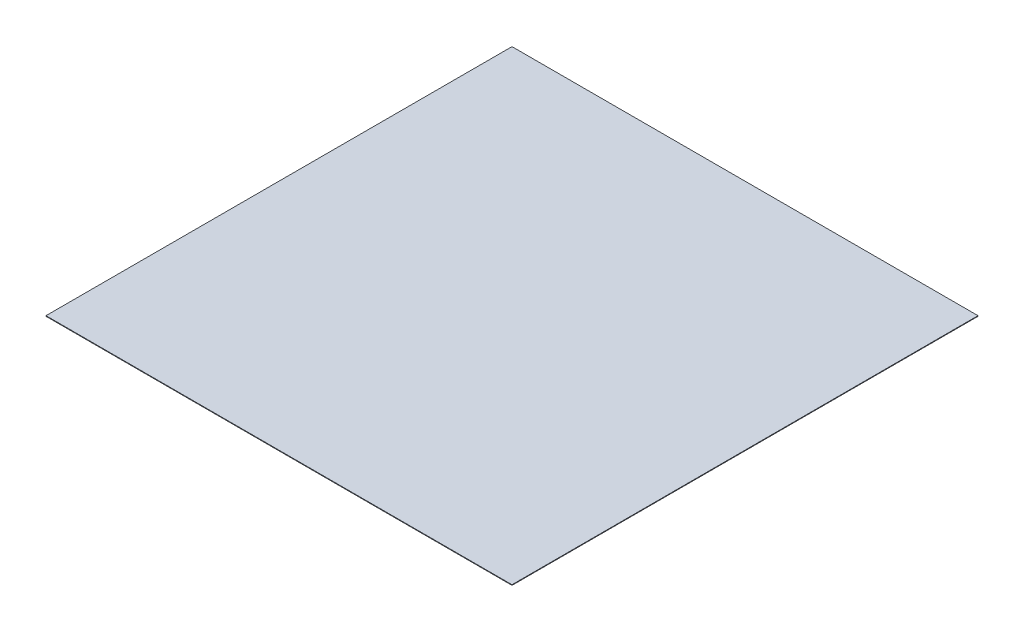
ISO-10303-21;
HEADER;
FILE_DESCRIPTION(('STEP AP214'),'2;1');
FILE_NAME('part.step','',(''),(''),'','','');
FILE_SCHEMA(('AUTOMOTIVE_DESIGN { 1 0 10303 214 1 1 1 1 }'));
ENDSEC;
DATA;
#1=APPLICATION_CONTEXT('core data for automotive mechanical design processes');
#2=APPLICATION_PROTOCOL_DEFINITION('international standard','automotive_design',2000,#1);
#3=PRODUCT_CONTEXT('',#1,'mechanical');
#4=PRODUCT('Part','Part','',(#3));
#5=PRODUCT_RELATED_PRODUCT_CATEGORY('part','',(#4));
#6=PRODUCT_DEFINITION_FORMATION('','',#4);
#7=PRODUCT_DEFINITION_CONTEXT('part definition',#1,'design');
#8=PRODUCT_DEFINITION('design','',#6,#7);
#9=PRODUCT_DEFINITION_SHAPE('','',#8);
#10=(LENGTH_UNIT() NAMED_UNIT(*) SI_UNIT(.MILLI.,.METRE.));
#11=(NAMED_UNIT(*) PLANE_ANGLE_UNIT() SI_UNIT($,.RADIAN.));
#12=(NAMED_UNIT(*) SI_UNIT($,.STERADIAN.) SOLID_ANGLE_UNIT());
#13=UNCERTAINTY_MEASURE_WITH_UNIT(LENGTH_MEASURE(1.E-05),#10,'distance_accuracy_value','');
#14=(GEOMETRIC_REPRESENTATION_CONTEXT(3) GLOBAL_UNCERTAINTY_ASSIGNED_CONTEXT((#13)) GLOBAL_UNIT_ASSIGNED_CONTEXT((#10,
#11,#12)) REPRESENTATION_CONTEXT('',''));
#15=CARTESIAN_POINT('',(0.,0.,0.));
#16=DIRECTION('',(0.,0.,1.));
#17=DIRECTION('',(1.,0.,0.));
#18=AXIS2_PLACEMENT_3D('',#15,#16,#17);
#19=CARTESIAN_POINT('',(7770.36858974359,-78.1666666666667,8000.));
#20=DIRECTION('',(-1.,0.,0.));
#21=DIRECTION('',(0.,0.,1.));
#22=AXIS2_PLACEMENT_3D('',#19,#20,#21);
#23=PLANE('',#22);
#24=DIRECTION('',(0.,1.,0.));
#25=VECTOR('',#24,1.);
#26=CARTESIAN_POINT('',(7770.36858974359,-78.1666666666667,0.));
#27=LINE('',#26,#25);
#28=CARTESIAN_POINT('',(7770.36858974359,-78.1666666666667,0.));
#29=VERTEX_POINT('',#28);
#30=CARTESIAN_POINT('',(7770.36858974359,-68.1666666666657,0.));
#31=VERTEX_POINT('',#30);
#32=EDGE_CURVE('E108',#29,#31,#27,.T.);
#33=ORIENTED_EDGE('',*,*,#32,.T.);
#34=DIRECTION('',(0.,0.,-1.));
#35=VECTOR('',#34,1.);
#36=CARTESIAN_POINT('',(7770.36858974359,-68.1666666666657,8000.));
#37=LINE('',#36,#35);
#38=CARTESIAN_POINT('',(7770.36858974359,-68.1666666666657,8000.));
#39=VERTEX_POINT('',#38);
#40=EDGE_CURVE('E11',#39,#31,#37,.T.);
#41=ORIENTED_EDGE('',*,*,#40,.F.);
#42=DIRECTION('',(0.,1.,0.));
#43=VECTOR('',#42,1.);
#44=CARTESIAN_POINT('',(7770.36858974359,-78.1666666666667,8000.));
#45=LINE('',#44,#43);
#46=CARTESIAN_POINT('',(7770.36858974359,-78.1666666666667,8000.));
#47=VERTEX_POINT('',#46);
#48=EDGE_CURVE('E96',#47,#39,#45,.T.);
#49=ORIENTED_EDGE('',*,*,#48,.F.);
#50=DIRECTION('',(0.,0.,-1.));
#51=VECTOR('',#50,1.);
#52=CARTESIAN_POINT('',(7770.36858974359,-78.1666666666667,8000.));
#53=LINE('',#52,#51);
#54=EDGE_CURVE('E104',#47,#29,#53,.T.);
#55=ORIENTED_EDGE('',*,*,#54,.T.);
#56=EDGE_LOOP('',(#33,#41,#49,#55));
#57=FACE_BOUND('',#56,.T.);
#58=ADVANCED_FACE('F45',(#57),#23,.F.);
#59=CARTESIAN_POINT('',(7770.36858974359,-68.1666666666657,8000.));
#60=DIRECTION('',(0.,-1.,0.));
#61=DIRECTION('',(1.,0.,0.));
#62=AXIS2_PLACEMENT_3D('',#59,#60,#61);
#63=PLANE('',#62);
#64=DIRECTION('',(-1.,0.,0.));
#65=VECTOR('',#64,1.);
#66=CARTESIAN_POINT('',(7770.36858974359,-68.1666666666657,0.));
#67=LINE('',#66,#65);
#68=CARTESIAN_POINT('',(-229.63141025641,-68.1666666666667,0.));
#69=VERTEX_POINT('',#68);
#70=EDGE_CURVE('E100',#31,#69,#67,.T.);
#71=ORIENTED_EDGE('',*,*,#70,.T.);
#72=DIRECTION('',(0.,0.,-1.));
#73=VECTOR('',#72,1.);
#74=CARTESIAN_POINT('',(-229.63141025641,-68.1666666666667,8000.));
#75=LINE('',#74,#73);
#76=CARTESIAN_POINT('',(-229.63141025641,-68.1666666666667,8000.));
#77=VERTEX_POINT('',#76);
#78=EDGE_CURVE('E53',#77,#69,#75,.T.);
#79=ORIENTED_EDGE('',*,*,#78,.F.);
#80=DIRECTION('',(-1.,0.,0.));
#81=VECTOR('',#80,1.);
#82=CARTESIAN_POINT('',(7770.36858974359,-68.1666666666657,8000.));
#83=LINE('',#82,#81);
#84=EDGE_CURVE('E91',#39,#77,#83,.T.);
#85=ORIENTED_EDGE('',*,*,#84,.F.);
#86=ORIENTED_EDGE('',*,*,#40,.T.);
#87=EDGE_LOOP('',(#71,#79,#85,#86));
#88=FACE_BOUND('',#87,.T.);
#89=ADVANCED_FACE('F99',(#88),#63,.F.);
#90=CARTESIAN_POINT('',(-229.63141025641,-68.1666666666667,8000.));
#91=DIRECTION('',(1.,0.,0.));
#92=DIRECTION('',(0.,0.,-1.));
#93=AXIS2_PLACEMENT_3D('',#90,#91,#92);
#94=PLANE('',#93);
#95=DIRECTION('',(0.,-1.,0.));
#96=VECTOR('',#95,1.);
#97=CARTESIAN_POINT('',(-229.63141025641,-68.1666666666667,0.));
#98=LINE('',#97,#96);
#99=CARTESIAN_POINT('',(-229.63141025641,-78.1666666666667,0.));
#100=VERTEX_POINT('',#99);
#101=EDGE_CURVE('E78',#69,#100,#98,.T.);
#102=ORIENTED_EDGE('',*,*,#101,.T.);
#103=DIRECTION('',(0.,0.,-1.));
#104=VECTOR('',#103,1.);
#105=CARTESIAN_POINT('',(-229.63141025641,-78.1666666666667,8000.));
#106=LINE('',#105,#104);
#107=CARTESIAN_POINT('',(-229.63141025641,-78.1666666666667,8000.));
#108=VERTEX_POINT('',#107);
#109=EDGE_CURVE('E101',#108,#100,#106,.T.);
#110=ORIENTED_EDGE('',*,*,#109,.F.);
#111=DIRECTION('',(0.,-1.,0.));
#112=VECTOR('',#111,1.);
#113=CARTESIAN_POINT('',(-229.63141025641,-68.1666666666667,8000.));
#114=LINE('',#113,#112);
#115=EDGE_CURVE('E94',#77,#108,#114,.T.);
#116=ORIENTED_EDGE('',*,*,#115,.F.);
#117=ORIENTED_EDGE('',*,*,#78,.T.);
#118=EDGE_LOOP('',(#102,#110,#116,#117));
#119=FACE_BOUND('',#118,.T.);
#120=ADVANCED_FACE('F102',(#119),#94,.F.);
#121=CARTESIAN_POINT('',(-229.63141025641,-78.1666666666667,8000.));
#122=DIRECTION('',(0.,1.,0.));
#123=DIRECTION('',(-1.,0.,0.));
#124=AXIS2_PLACEMENT_3D('',#121,#122,#123);
#125=PLANE('',#124);
#126=DIRECTION('',(1.,0.,0.));
#127=VECTOR('',#126,1.);
#128=CARTESIAN_POINT('',(-229.63141025641,-78.1666666666667,0.));
#129=LINE('',#128,#127);
#130=EDGE_CURVE('E84',#100,#29,#129,.T.);
#131=ORIENTED_EDGE('',*,*,#130,.T.);
#132=ORIENTED_EDGE('',*,*,#54,.F.);
#133=DIRECTION('',(1.,0.,0.));
#134=VECTOR('',#133,1.);
#135=CARTESIAN_POINT('',(-229.63141025641,-78.1666666666667,8000.));
#136=LINE('',#135,#134);
#137=EDGE_CURVE('E61',#108,#47,#136,.T.);
#138=ORIENTED_EDGE('',*,*,#137,.F.);
#139=ORIENTED_EDGE('',*,*,#109,.T.);
#140=EDGE_LOOP('',(#131,#132,#138,#139));
#141=FACE_BOUND('',#140,.T.);
#142=ADVANCED_FACE('F115',(#141),#125,.F.);
#143=CARTESIAN_POINT('',(0.,0.,8000.));
#144=DIRECTION('',(0.,0.,1.));
#145=DIRECTION('',(1.,0.,0.));
#146=AXIS2_PLACEMENT_3D('',#143,#144,#145);
#147=PLANE('',#146);
#148=ORIENTED_EDGE('',*,*,#48,.T.);
#149=ORIENTED_EDGE('',*,*,#84,.T.);
#150=ORIENTED_EDGE('',*,*,#115,.T.);
#151=ORIENTED_EDGE('',*,*,#137,.T.);
#152=EDGE_LOOP('',(#148,#149,#150,#151));
#153=FACE_BOUND('',#152,.T.);
#154=ADVANCED_FACE('F92',(#153),#147,.T.);
#155=CARTESIAN_POINT('',(0.,0.,0.));
#156=DIRECTION('',(0.,0.,1.));
#157=DIRECTION('',(1.,0.,0.));
#158=AXIS2_PLACEMENT_3D('',#155,#156,#157);
#159=PLANE('',#158);
#160=ORIENTED_EDGE('',*,*,#32,.F.);
#161=ORIENTED_EDGE('',*,*,#130,.F.);
#162=ORIENTED_EDGE('',*,*,#101,.F.);
#163=ORIENTED_EDGE('',*,*,#70,.F.);
#164=EDGE_LOOP('',(#160,#161,#162,#163));
#165=FACE_BOUND('',#164,.T.);
#166=ADVANCED_FACE('F118',(#165),#159,.F.);
#167=CLOSED_SHELL('',(#58,#89,#120,#142,#154,#166));
#168=MANIFOLD_SOLID_BREP('B2',#167);
#169=ADVANCED_BREP_SHAPE_REPRESENTATION('',(#18,#168),#14);
#170=SHAPE_DEFINITION_REPRESENTATION(#9,#169);
ENDSEC;
END-ISO-10303-21;
